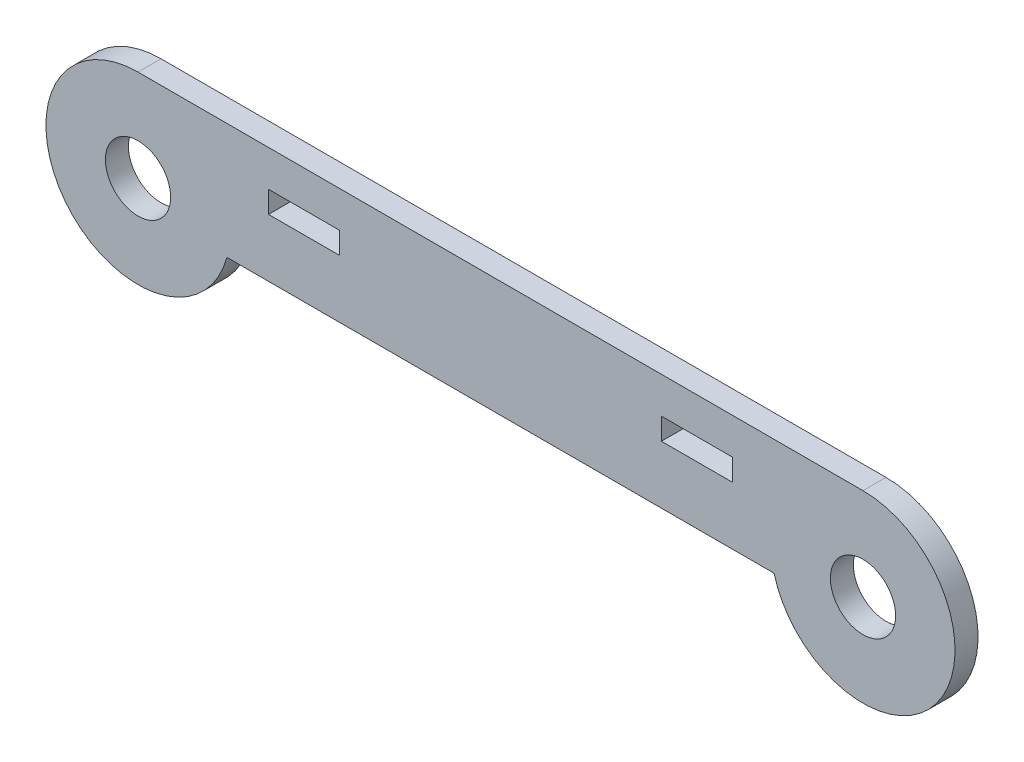
ISO-10303-21;
HEADER;
FILE_DESCRIPTION(('STEP AP214'),'2;1');
FILE_NAME('part.step','',(''),(''),'','','');
FILE_SCHEMA(('AUTOMOTIVE_DESIGN { 1 0 10303 214 1 1 1 1 }'));
ENDSEC;
DATA;
#1=APPLICATION_CONTEXT('core data for automotive mechanical design processes');
#2=APPLICATION_PROTOCOL_DEFINITION('international standard','automotive_design',2000,#1);
#3=PRODUCT_CONTEXT('',#1,'mechanical');
#4=PRODUCT('Part','Part','',(#3));
#5=PRODUCT_RELATED_PRODUCT_CATEGORY('part','',(#4));
#6=PRODUCT_DEFINITION_FORMATION('','',#4);
#7=PRODUCT_DEFINITION_CONTEXT('part definition',#1,'design');
#8=PRODUCT_DEFINITION('design','',#6,#7);
#9=PRODUCT_DEFINITION_SHAPE('','',#8);
#10=(LENGTH_UNIT() NAMED_UNIT(*) SI_UNIT(.MILLI.,.METRE.));
#11=(NAMED_UNIT(*) PLANE_ANGLE_UNIT() SI_UNIT($,.RADIAN.));
#12=(NAMED_UNIT(*) SI_UNIT($,.STERADIAN.) SOLID_ANGLE_UNIT());
#13=UNCERTAINTY_MEASURE_WITH_UNIT(LENGTH_MEASURE(1.E-05),#10,'distance_accuracy_value','');
#14=(GEOMETRIC_REPRESENTATION_CONTEXT(3) GLOBAL_UNCERTAINTY_ASSIGNED_CONTEXT((#13)) GLOBAL_UNIT_ASSIGNED_CONTEXT((#10,
#11,#12)) REPRESENTATION_CONTEXT('',''));
#15=CARTESIAN_POINT('',(0.,0.,0.));
#16=DIRECTION('',(0.,0.,1.));
#17=DIRECTION('',(1.,0.,0.));
#18=AXIS2_PLACEMENT_3D('',#15,#16,#17);
#19=CARTESIAN_POINT('',(0.,3.84999999999999,1.5875));
#20=DIRECTION('',(0.,-1.,0.));
#21=DIRECTION('',(1.,0.,0.));
#22=AXIS2_PLACEMENT_3D('',#19,#20,#21);
#23=PLANE('',#22);
#24=DIRECTION('',(-1.,0.,0.));
#25=VECTOR('',#24,1.);
#26=CARTESIAN_POINT('',(0.,3.84999999999999,0.));
#27=LINE('',#26,#25);
#28=CARTESIAN_POINT('',(41.,3.85,0.));
#29=VERTEX_POINT('',#28);
#30=CARTESIAN_POINT('',(36.1,3.85,0.));
#31=VERTEX_POINT('',#30);
#32=EDGE_CURVE('E321',#29,#31,#27,.T.);
#33=ORIENTED_EDGE('',*,*,#32,.F.);
#34=DIRECTION('',(0.,0.,-1.));
#35=VECTOR('',#34,1.);
#36=CARTESIAN_POINT('',(41.,3.85,1.5875));
#37=LINE('',#36,#35);
#38=CARTESIAN_POINT('',(41.,3.85,1.5875));
#39=VERTEX_POINT('',#38);
#40=EDGE_CURVE('E12',#39,#29,#37,.T.);
#41=ORIENTED_EDGE('',*,*,#40,.F.);
#42=DIRECTION('',(-1.,0.,0.));
#43=VECTOR('',#42,1.);
#44=CARTESIAN_POINT('',(0.,3.84999999999999,1.5875));
#45=LINE('',#44,#43);
#46=CARTESIAN_POINT('',(36.1,3.85,1.5875));
#47=VERTEX_POINT('',#46);
#48=EDGE_CURVE('E160',#39,#47,#45,.T.);
#49=ORIENTED_EDGE('',*,*,#48,.T.);
#50=DIRECTION('',(0.,0.,-1.));
#51=VECTOR('',#50,1.);
#52=CARTESIAN_POINT('',(36.1,3.85,1.5875));
#53=LINE('',#52,#51);
#54=EDGE_CURVE('E107',#47,#31,#53,.T.);
#55=ORIENTED_EDGE('',*,*,#54,.T.);
#56=EDGE_LOOP('',(#33,#41,#49,#55));
#57=FACE_BOUND('',#56,.T.);
#58=ADVANCED_FACE('F41',(#57),#23,.T.);
#59=CARTESIAN_POINT('',(41.,0.,1.5875));
#60=DIRECTION('',(-1.,0.,0.));
#61=DIRECTION('',(0.,0.,1.));
#62=AXIS2_PLACEMENT_3D('',#59,#60,#61);
#63=PLANE('',#62);
#64=DIRECTION('',(0.,1.,0.));
#65=VECTOR('',#64,1.);
#66=CARTESIAN_POINT('',(41.,0.,0.));
#67=LINE('',#66,#65);
#68=CARTESIAN_POINT('',(41.,2.35,0.));
#69=VERTEX_POINT('',#68);
#70=EDGE_CURVE('E148',#69,#29,#67,.T.);
#71=ORIENTED_EDGE('',*,*,#70,.F.);
#72=DIRECTION('',(0.,0.,-1.));
#73=VECTOR('',#72,1.);
#74=CARTESIAN_POINT('',(41.,2.35,1.5875));
#75=LINE('',#74,#73);
#76=CARTESIAN_POINT('',(41.,2.35,1.5875));
#77=VERTEX_POINT('',#76);
#78=EDGE_CURVE('E51',#77,#69,#75,.T.);
#79=ORIENTED_EDGE('',*,*,#78,.F.);
#80=DIRECTION('',(0.,1.,0.));
#81=VECTOR('',#80,1.);
#82=CARTESIAN_POINT('',(41.,0.,1.5875));
#83=LINE('',#82,#81);
#84=EDGE_CURVE('E146',#77,#39,#83,.T.);
#85=ORIENTED_EDGE('',*,*,#84,.T.);
#86=ORIENTED_EDGE('',*,*,#40,.T.);
#87=EDGE_LOOP('',(#71,#79,#85,#86));
#88=FACE_BOUND('',#87,.T.);
#89=ADVANCED_FACE('F144',(#88),#63,.T.);
#90=CARTESIAN_POINT('',(0.,2.34999999999999,1.5875));
#91=DIRECTION('',(0.,-1.,0.));
#92=DIRECTION('',(1.,0.,0.));
#93=AXIS2_PLACEMENT_3D('',#90,#91,#92);
#94=PLANE('',#93);
#95=DIRECTION('',(-1.,0.,0.));
#96=VECTOR('',#95,1.);
#97=CARTESIAN_POINT('',(0.,2.34999999999999,0.));
#98=LINE('',#97,#96);
#99=CARTESIAN_POINT('',(36.1,2.35,0.));
#100=VERTEX_POINT('',#99);
#101=EDGE_CURVE('E324',#69,#100,#98,.T.);
#102=ORIENTED_EDGE('',*,*,#101,.T.);
#103=DIRECTION('',(0.,0.,-1.));
#104=VECTOR('',#103,1.);
#105=CARTESIAN_POINT('',(36.1,2.35,1.5875));
#106=LINE('',#105,#104);
#107=CARTESIAN_POINT('',(36.1,2.35,1.5875));
#108=VERTEX_POINT('',#107);
#109=EDGE_CURVE('E151',#108,#100,#106,.T.);
#110=ORIENTED_EDGE('',*,*,#109,.F.);
#111=DIRECTION('',(-1.,0.,0.));
#112=VECTOR('',#111,1.);
#113=CARTESIAN_POINT('',(0.,2.34999999999999,1.5875));
#114=LINE('',#113,#112);
#115=EDGE_CURVE('E154',#77,#108,#114,.T.);
#116=ORIENTED_EDGE('',*,*,#115,.F.);
#117=ORIENTED_EDGE('',*,*,#78,.T.);
#118=EDGE_LOOP('',(#102,#110,#116,#117));
#119=FACE_BOUND('',#118,.T.);
#120=ADVANCED_FACE('F155',(#119),#94,.F.);
#121=CARTESIAN_POINT('',(13.9,0.,1.5875));
#122=DIRECTION('',(-1.,0.,0.));
#123=DIRECTION('',(0.,0.,1.));
#124=AXIS2_PLACEMENT_3D('',#121,#122,#123);
#125=PLANE('',#124);
#126=DIRECTION('',(0.,1.,0.));
#127=VECTOR('',#126,1.);
#128=CARTESIAN_POINT('',(13.9,0.,0.));
#129=LINE('',#128,#127);
#130=CARTESIAN_POINT('',(13.9,2.35,0.));
#131=VERTEX_POINT('',#130);
#132=CARTESIAN_POINT('',(13.9,3.85,0.));
#133=VERTEX_POINT('',#132);
#134=EDGE_CURVE('E277',#131,#133,#129,.T.);
#135=ORIENTED_EDGE('',*,*,#134,.F.);
#136=DIRECTION('',(0.,0.,-1.));
#137=VECTOR('',#136,1.);
#138=CARTESIAN_POINT('',(13.9,2.35,1.5875));
#139=LINE('',#138,#137);
#140=CARTESIAN_POINT('',(13.9,2.35,1.5875));
#141=VERTEX_POINT('',#140);
#142=EDGE_CURVE('E276',#141,#131,#139,.T.);
#143=ORIENTED_EDGE('',*,*,#142,.F.);
#144=DIRECTION('',(0.,1.,0.));
#145=VECTOR('',#144,1.);
#146=CARTESIAN_POINT('',(13.9,0.,1.5875));
#147=LINE('',#146,#145);
#148=CARTESIAN_POINT('',(13.9,3.85,1.5875));
#149=VERTEX_POINT('',#148);
#150=EDGE_CURVE('E238',#141,#149,#147,.T.);
#151=ORIENTED_EDGE('',*,*,#150,.T.);
#152=DIRECTION('',(0.,0.,-1.));
#153=VECTOR('',#152,1.);
#154=CARTESIAN_POINT('',(13.9,3.85,1.5875));
#155=LINE('',#154,#153);
#156=EDGE_CURVE('E267',#149,#133,#155,.T.);
#157=ORIENTED_EDGE('',*,*,#156,.T.);
#158=EDGE_LOOP('',(#135,#143,#151,#157));
#159=FACE_BOUND('',#158,.T.);
#160=ADVANCED_FACE('F275',(#159),#125,.T.);
#161=CARTESIAN_POINT('',(0.,2.35,1.5875));
#162=DIRECTION('',(0.,1.,0.));
#163=DIRECTION('',(0.,0.,1.));
#164=AXIS2_PLACEMENT_3D('',#161,#162,#163);
#165=PLANE('',#164);
#166=DIRECTION('',(1.,0.,0.));
#167=VECTOR('',#166,1.);
#168=CARTESIAN_POINT('',(0.,2.35,0.));
#169=LINE('',#168,#167);
#170=CARTESIAN_POINT('',(9.,2.35,0.));
#171=VERTEX_POINT('',#170);
#172=EDGE_CURVE('E315',#171,#131,#169,.T.);
#173=ORIENTED_EDGE('',*,*,#172,.F.);
#174=DIRECTION('',(0.,0.,-1.));
#175=VECTOR('',#174,1.);
#176=CARTESIAN_POINT('',(9.,2.35,1.5875));
#177=LINE('',#176,#175);
#178=CARTESIAN_POINT('',(9.,2.35,1.5875));
#179=VERTEX_POINT('',#178);
#180=EDGE_CURVE('E281',#179,#171,#177,.T.);
#181=ORIENTED_EDGE('',*,*,#180,.F.);
#182=DIRECTION('',(1.,0.,0.));
#183=VECTOR('',#182,1.);
#184=CARTESIAN_POINT('',(0.,2.35,1.5875));
#185=LINE('',#184,#183);
#186=EDGE_CURVE('E242',#179,#141,#185,.T.);
#187=ORIENTED_EDGE('',*,*,#186,.T.);
#188=ORIENTED_EDGE('',*,*,#142,.T.);
#189=EDGE_LOOP('',(#173,#181,#187,#188));
#190=FACE_BOUND('',#189,.T.);
#191=ADVANCED_FACE('F334',(#190),#165,.T.);
#192=CARTESIAN_POINT('',(9.,0.,1.5875));
#193=DIRECTION('',(-1.,0.,0.));
#194=DIRECTION('',(0.,0.,1.));
#195=AXIS2_PLACEMENT_3D('',#192,#193,#194);
#196=PLANE('',#195);
#197=DIRECTION('',(0.,1.,0.));
#198=VECTOR('',#197,1.);
#199=CARTESIAN_POINT('',(9.,0.,0.));
#200=LINE('',#199,#198);
#201=CARTESIAN_POINT('',(9.,3.85,0.));
#202=VERTEX_POINT('',#201);
#203=EDGE_CURVE('E317',#171,#202,#200,.T.);
#204=ORIENTED_EDGE('',*,*,#203,.T.);
#205=DIRECTION('',(0.,0.,-1.));
#206=VECTOR('',#205,1.);
#207=CARTESIAN_POINT('',(9.,3.85,1.5875));
#208=LINE('',#207,#206);
#209=CARTESIAN_POINT('',(9.,3.85,1.5875));
#210=VERTEX_POINT('',#209);
#211=EDGE_CURVE('E273',#210,#202,#208,.T.);
#212=ORIENTED_EDGE('',*,*,#211,.F.);
#213=DIRECTION('',(0.,1.,0.));
#214=VECTOR('',#213,1.);
#215=CARTESIAN_POINT('',(9.,0.,1.5875));
#216=LINE('',#215,#214);
#217=EDGE_CURVE('E249',#179,#210,#216,.T.);
#218=ORIENTED_EDGE('',*,*,#217,.F.);
#219=ORIENTED_EDGE('',*,*,#180,.T.);
#220=EDGE_LOOP('',(#204,#212,#218,#219));
#221=FACE_BOUND('',#220,.T.);
#222=ADVANCED_FACE('F331',(#221),#196,.F.);
#223=CARTESIAN_POINT('',(0.,-1.65,1.5875));
#224=DIRECTION('',(0.,1.,0.));
#225=DIRECTION('',(-1.,0.,0.));
#226=AXIS2_PLACEMENT_3D('',#223,#224,#225);
#227=PLANE('',#226);
#228=DIRECTION('',(1.,0.,0.));
#229=VECTOR('',#228,1.);
#230=CARTESIAN_POINT('',(0.,-1.65,0.));
#231=LINE('',#230,#229);
#232=CARTESIAN_POINT('',(6.13188388670236,-1.65,0.));
#233=VERTEX_POINT('',#232);
#234=CARTESIAN_POINT('',(43.8681161132976,-1.65,0.));
#235=VERTEX_POINT('',#234);
#236=EDGE_CURVE('E303',#233,#235,#231,.T.);
#237=ORIENTED_EDGE('',*,*,#236,.T.);
#238=DIRECTION('',(0.,0.,-1.));
#239=VECTOR('',#238,1.);
#240=CARTESIAN_POINT('',(43.8681161132976,-1.65,1.5875));
#241=LINE('',#240,#239);
#242=CARTESIAN_POINT('',(43.8681161132976,-1.65,1.5875));
#243=VERTEX_POINT('',#242);
#244=EDGE_CURVE('E45',#243,#235,#241,.T.);
#245=ORIENTED_EDGE('',*,*,#244,.F.);
#246=DIRECTION('',(1.,0.,0.));
#247=VECTOR('',#246,1.);
#248=CARTESIAN_POINT('',(0.,-1.65,1.5875));
#249=LINE('',#248,#247);
#250=CARTESIAN_POINT('',(6.13188388670236,-1.65,1.5875));
#251=VERTEX_POINT('',#250);
#252=EDGE_CURVE('E210',#251,#243,#249,.T.);
#253=ORIENTED_EDGE('',*,*,#252,.F.);
#254=DIRECTION('',(0.,0.,-1.));
#255=VECTOR('',#254,1.);
#256=CARTESIAN_POINT('',(6.13188388670236,-1.65,1.5875));
#257=LINE('',#256,#255);
#258=EDGE_CURVE('E287',#251,#233,#257,.T.);
#259=ORIENTED_EDGE('',*,*,#258,.T.);
#260=EDGE_LOOP('',(#237,#245,#253,#259));
#261=FACE_BOUND('',#260,.T.);
#262=ADVANCED_FACE('F43',(#261),#227,.F.);
#263=CARTESIAN_POINT('',(50.,0.,1.5875));
#264=DIRECTION('',(0.,0.,-1.));
#265=DIRECTION('',(-1.,0.,0.));
#266=AXIS2_PLACEMENT_3D('',#263,#264,#265);
#267=CYLINDRICAL_SURFACE('',#266,6.35);
#268=CARTESIAN_POINT('',(50.,0.,0.));
#269=DIRECTION('',(0.,0.,1.));
#270=DIRECTION('',(1.,0.,0.));
#271=AXIS2_PLACEMENT_3D('',#268,#269,#270);
#272=CIRCLE('',#271,6.35);
#273=CARTESIAN_POINT('',(50.,6.35,0.));
#274=VERTEX_POINT('',#273);
#275=EDGE_CURVE('E298',#235,#274,#272,.T.);
#276=ORIENTED_EDGE('',*,*,#275,.T.);
#277=DIRECTION('',(0.,0.,-1.));
#278=VECTOR('',#277,1.);
#279=CARTESIAN_POINT('',(50.,6.35,1.5875));
#280=LINE('',#279,#278);
#281=CARTESIAN_POINT('',(50.,6.35,1.5875));
#282=VERTEX_POINT('',#281);
#283=EDGE_CURVE('E291',#282,#274,#280,.T.);
#284=ORIENTED_EDGE('',*,*,#283,.F.);
#285=CARTESIAN_POINT('',(50.,0.,1.5875));
#286=DIRECTION('',(0.,0.,1.));
#287=DIRECTION('',(1.,0.,0.));
#288=AXIS2_PLACEMENT_3D('',#285,#286,#287);
#289=CIRCLE('',#288,6.35);
#290=EDGE_CURVE('E115',#243,#282,#289,.T.);
#291=ORIENTED_EDGE('',*,*,#290,.F.);
#292=ORIENTED_EDGE('',*,*,#244,.T.);
#293=EDGE_LOOP('',(#276,#284,#291,#292));
#294=FACE_BOUND('',#293,.T.);
#295=ADVANCED_FACE('F297',(#294),#267,.T.);
#296=CARTESIAN_POINT('',(0.,6.35,1.5875));
#297=DIRECTION('',(0.,1.,0.));
#298=DIRECTION('',(-1.,0.,0.));
#299=AXIS2_PLACEMENT_3D('',#296,#297,#298);
#300=PLANE('',#299);
#301=DIRECTION('',(1.,0.,0.));
#302=VECTOR('',#301,1.);
#303=CARTESIAN_POINT('',(0.,6.35,0.));
#304=LINE('',#303,#302);
#305=CARTESIAN_POINT('',(0.,6.35,0.));
#306=VERTEX_POINT('',#305);
#307=EDGE_CURVE('E307',#306,#274,#304,.T.);
#308=ORIENTED_EDGE('',*,*,#307,.F.);
#309=DIRECTION('',(0.,0.,-1.));
#310=VECTOR('',#309,1.);
#311=CARTESIAN_POINT('',(0.,6.35,1.5875));
#312=LINE('',#311,#310);
#313=CARTESIAN_POINT('',(0.,6.35,1.5875));
#314=VERTEX_POINT('',#313);
#315=EDGE_CURVE('E290',#314,#306,#312,.T.);
#316=ORIENTED_EDGE('',*,*,#315,.F.);
#317=DIRECTION('',(1.,0.,0.));
#318=VECTOR('',#317,1.);
#319=CARTESIAN_POINT('',(0.,6.35,1.5875));
#320=LINE('',#319,#318);
#321=EDGE_CURVE('E224',#314,#282,#320,.T.);
#322=ORIENTED_EDGE('',*,*,#321,.T.);
#323=ORIENTED_EDGE('',*,*,#283,.T.);
#324=EDGE_LOOP('',(#308,#316,#322,#323));
#325=FACE_BOUND('',#324,.T.);
#326=ADVANCED_FACE('F340',(#325),#300,.T.);
#327=CARTESIAN_POINT('',(36.1,0.,1.5875));
#328=DIRECTION('',(-1.,0.,0.));
#329=DIRECTION('',(0.,0.,1.));
#330=AXIS2_PLACEMENT_3D('',#327,#328,#329);
#331=PLANE('',#330);
#332=DIRECTION('',(0.,1.,0.));
#333=VECTOR('',#332,1.);
#334=CARTESIAN_POINT('',(36.1,0.,0.));
#335=LINE('',#334,#333);
#336=EDGE_CURVE('E100',#100,#31,#335,.T.);
#337=ORIENTED_EDGE('',*,*,#336,.T.);
#338=ORIENTED_EDGE('',*,*,#54,.F.);
#339=DIRECTION('',(0.,1.,0.));
#340=VECTOR('',#339,1.);
#341=CARTESIAN_POINT('',(36.1,0.,1.5875));
#342=LINE('',#341,#340);
#343=EDGE_CURVE('E60',#108,#47,#342,.T.);
#344=ORIENTED_EDGE('',*,*,#343,.F.);
#345=ORIENTED_EDGE('',*,*,#109,.T.);
#346=EDGE_LOOP('',(#337,#338,#344,#345));
#347=FACE_BOUND('',#346,.T.);
#348=ADVANCED_FACE('F368',(#347),#331,.F.);
#349=CARTESIAN_POINT('',(0.,3.85,1.5875));
#350=DIRECTION('',(0.,1.,0.));
#351=DIRECTION('',(0.,0.,1.));
#352=AXIS2_PLACEMENT_3D('',#349,#350,#351);
#353=PLANE('',#352);
#354=DIRECTION('',(1.,0.,0.));
#355=VECTOR('',#354,1.);
#356=CARTESIAN_POINT('',(0.,3.85,0.));
#357=LINE('',#356,#355);
#358=EDGE_CURVE('E269',#202,#133,#357,.T.);
#359=ORIENTED_EDGE('',*,*,#358,.T.);
#360=ORIENTED_EDGE('',*,*,#156,.F.);
#361=DIRECTION('',(1.,0.,0.));
#362=VECTOR('',#361,1.);
#363=CARTESIAN_POINT('',(0.,3.85,1.5875));
#364=LINE('',#363,#362);
#365=EDGE_CURVE('E164',#210,#149,#364,.T.);
#366=ORIENTED_EDGE('',*,*,#365,.F.);
#367=ORIENTED_EDGE('',*,*,#211,.T.);
#368=EDGE_LOOP('',(#359,#360,#366,#367));
#369=FACE_BOUND('',#368,.T.);
#370=ADVANCED_FACE('F268',(#369),#353,.F.);
#371=CARTESIAN_POINT('',(0.,0.,1.5875));
#372=DIRECTION('',(0.,0.,-1.));
#373=DIRECTION('',(-1.,0.,0.));
#374=AXIS2_PLACEMENT_3D('',#371,#372,#373);
#375=CYLINDRICAL_SURFACE('',#374,6.35);
#376=CARTESIAN_POINT('',(0.,0.,0.));
#377=DIRECTION('',(0.,0.,1.));
#378=DIRECTION('',(1.,0.,0.));
#379=AXIS2_PLACEMENT_3D('',#376,#377,#378);
#380=CIRCLE('',#379,6.35);
#381=EDGE_CURVE('E312',#306,#233,#380,.T.);
#382=ORIENTED_EDGE('',*,*,#381,.T.);
#383=ORIENTED_EDGE('',*,*,#258,.F.);
#384=CARTESIAN_POINT('',(0.,0.,1.5875));
#385=DIRECTION('',(0.,0.,1.));
#386=DIRECTION('',(1.,0.,0.));
#387=AXIS2_PLACEMENT_3D('',#384,#385,#386);
#388=CIRCLE('',#387,6.35);
#389=EDGE_CURVE('E228',#314,#251,#388,.T.);
#390=ORIENTED_EDGE('',*,*,#389,.F.);
#391=ORIENTED_EDGE('',*,*,#315,.T.);
#392=EDGE_LOOP('',(#382,#383,#390,#391));
#393=FACE_BOUND('',#392,.T.);
#394=ADVANCED_FACE('F343',(#393),#375,.T.);
#395=CARTESIAN_POINT('',(50.,0.,1.5875));
#396=DIRECTION('',(0.,0.,-1.));
#397=DIRECTION('',(-1.,0.,0.));
#398=AXIS2_PLACEMENT_3D('',#395,#396,#397);
#399=CYLINDRICAL_SURFACE('',#398,2.25);
#400=CARTESIAN_POINT('',(50.,0.,1.5875));
#401=DIRECTION('',(0.,0.,1.));
#402=DIRECTION('',(1.,0.,0.));
#403=AXIS2_PLACEMENT_3D('',#400,#401,#402);
#404=CIRCLE('',#403,2.25);
#405=CARTESIAN_POINT('',(52.25,0.,1.5875));
#406=VERTEX_POINT('',#405);
#407=EDGE_CURVE('E181',#406,#406,#404,.T.);
#408=ORIENTED_EDGE('',*,*,#407,.T.);
#409=EDGE_LOOP('',(#408));
#410=FACE_BOUND('',#409,.T.);
#411=CARTESIAN_POINT('',(50.,0.,0.));
#412=DIRECTION('',(0.,0.,1.));
#413=DIRECTION('',(1.,0.,0.));
#414=AXIS2_PLACEMENT_3D('',#411,#412,#413);
#415=CIRCLE('',#414,2.25);
#416=CARTESIAN_POINT('',(52.25,0.,0.));
#417=VERTEX_POINT('',#416);
#418=EDGE_CURVE('E214',#417,#417,#415,.T.);
#419=ORIENTED_EDGE('',*,*,#418,.F.);
#420=EDGE_LOOP('',(#419));
#421=FACE_BOUND('',#420,.T.);
#422=ADVANCED_FACE('F354',(#410,#421),#399,.F.);
#423=CARTESIAN_POINT('',(0.,0.,1.5875));
#424=DIRECTION('',(0.,0.,1.));
#425=DIRECTION('',(1.,0.,0.));
#426=AXIS2_PLACEMENT_3D('',#423,#424,#425);
#427=PLANE('',#426);
#428=CARTESIAN_POINT('',(0.,0.,1.5875));
#429=DIRECTION('',(0.,0.,1.));
#430=DIRECTION('',(1.,0.,0.));
#431=AXIS2_PLACEMENT_3D('',#428,#429,#430);
#432=CIRCLE('',#431,2.25);
#433=CARTESIAN_POINT('',(2.25,0.,1.5875));
#434=VERTEX_POINT('',#433);
#435=EDGE_CURVE('E204',#434,#434,#432,.T.);
#436=ORIENTED_EDGE('',*,*,#435,.F.);
#437=EDGE_LOOP('',(#436));
#438=FACE_BOUND('',#437,.T.);
#439=ORIENTED_EDGE('',*,*,#252,.T.);
#440=ORIENTED_EDGE('',*,*,#290,.T.);
#441=ORIENTED_EDGE('',*,*,#321,.F.);
#442=ORIENTED_EDGE('',*,*,#389,.T.);
#443=EDGE_LOOP('',(#439,#440,#441,#442));
#444=FACE_BOUND('',#443,.T.);
#445=ORIENTED_EDGE('',*,*,#150,.F.);
#446=ORIENTED_EDGE('',*,*,#186,.F.);
#447=ORIENTED_EDGE('',*,*,#217,.T.);
#448=ORIENTED_EDGE('',*,*,#365,.T.);
#449=EDGE_LOOP('',(#445,#446,#447,#448));
#450=FACE_BOUND('',#449,.T.);
#451=ORIENTED_EDGE('',*,*,#48,.F.);
#452=ORIENTED_EDGE('',*,*,#84,.F.);
#453=ORIENTED_EDGE('',*,*,#115,.T.);
#454=ORIENTED_EDGE('',*,*,#343,.T.);
#455=EDGE_LOOP('',(#451,#452,#453,#454));
#456=FACE_BOUND('',#455,.T.);
#457=ORIENTED_EDGE('',*,*,#407,.F.);
#458=EDGE_LOOP('',(#457));
#459=FACE_BOUND('',#458,.T.);
#460=ADVANCED_FACE('F158',(#438,#444,#450,#456,#459),#427,.T.);
#461=CARTESIAN_POINT('',(0.,0.,0.));
#462=DIRECTION('',(0.,0.,1.));
#463=DIRECTION('',(1.,0.,0.));
#464=AXIS2_PLACEMENT_3D('',#461,#462,#463);
#465=PLANE('',#464);
#466=CARTESIAN_POINT('',(0.,0.,0.));
#467=DIRECTION('',(0.,0.,1.));
#468=DIRECTION('',(1.,0.,0.));
#469=AXIS2_PLACEMENT_3D('',#466,#467,#468);
#470=CIRCLE('',#469,2.25);
#471=CARTESIAN_POINT('',(2.25,0.,0.));
#472=VERTEX_POINT('',#471);
#473=EDGE_CURVE('E209',#472,#472,#470,.T.);
#474=ORIENTED_EDGE('',*,*,#473,.T.);
#475=EDGE_LOOP('',(#474));
#476=FACE_BOUND('',#475,.T.);
#477=ORIENTED_EDGE('',*,*,#236,.F.);
#478=ORIENTED_EDGE('',*,*,#381,.F.);
#479=ORIENTED_EDGE('',*,*,#307,.T.);
#480=ORIENTED_EDGE('',*,*,#275,.F.);
#481=EDGE_LOOP('',(#477,#478,#479,#480));
#482=FACE_BOUND('',#481,.T.);
#483=ORIENTED_EDGE('',*,*,#134,.T.);
#484=ORIENTED_EDGE('',*,*,#358,.F.);
#485=ORIENTED_EDGE('',*,*,#203,.F.);
#486=ORIENTED_EDGE('',*,*,#172,.T.);
#487=EDGE_LOOP('',(#483,#484,#485,#486));
#488=FACE_BOUND('',#487,.T.);
#489=ORIENTED_EDGE('',*,*,#32,.T.);
#490=ORIENTED_EDGE('',*,*,#336,.F.);
#491=ORIENTED_EDGE('',*,*,#101,.F.);
#492=ORIENTED_EDGE('',*,*,#70,.T.);
#493=EDGE_LOOP('',(#489,#490,#491,#492));
#494=FACE_BOUND('',#493,.T.);
#495=ORIENTED_EDGE('',*,*,#418,.T.);
#496=EDGE_LOOP('',(#495));
#497=FACE_BOUND('',#496,.T.);
#498=ADVANCED_FACE('F333',(#476,#482,#488,#494,#497),#465,.F.);
#499=CARTESIAN_POINT('',(0.,0.,0.));
#500=DIRECTION('',(0.,0.,1.));
#501=DIRECTION('',(1.,0.,0.));
#502=AXIS2_PLACEMENT_3D('',#499,#500,#501);
#503=CYLINDRICAL_SURFACE('',#502,2.25);
#504=ORIENTED_EDGE('',*,*,#473,.F.);
#505=EDGE_LOOP('',(#504));
#506=FACE_BOUND('',#505,.T.);
#507=ORIENTED_EDGE('',*,*,#435,.T.);
#508=EDGE_LOOP('',(#507));
#509=FACE_BOUND('',#508,.T.);
#510=ADVANCED_FACE('F345',(#506,#509),#503,.F.);
#511=CLOSED_SHELL('',(#58,#89,#120,#160,#191,#222,#262,#295,#326,#348,#370,#394,#422,#460,#498,#510));
#512=MANIFOLD_SOLID_BREP('B2',#511);
#513=ADVANCED_BREP_SHAPE_REPRESENTATION('',(#18,#512),#14);
#514=SHAPE_DEFINITION_REPRESENTATION(#9,#513);
ENDSEC;
END-ISO-10303-21;
